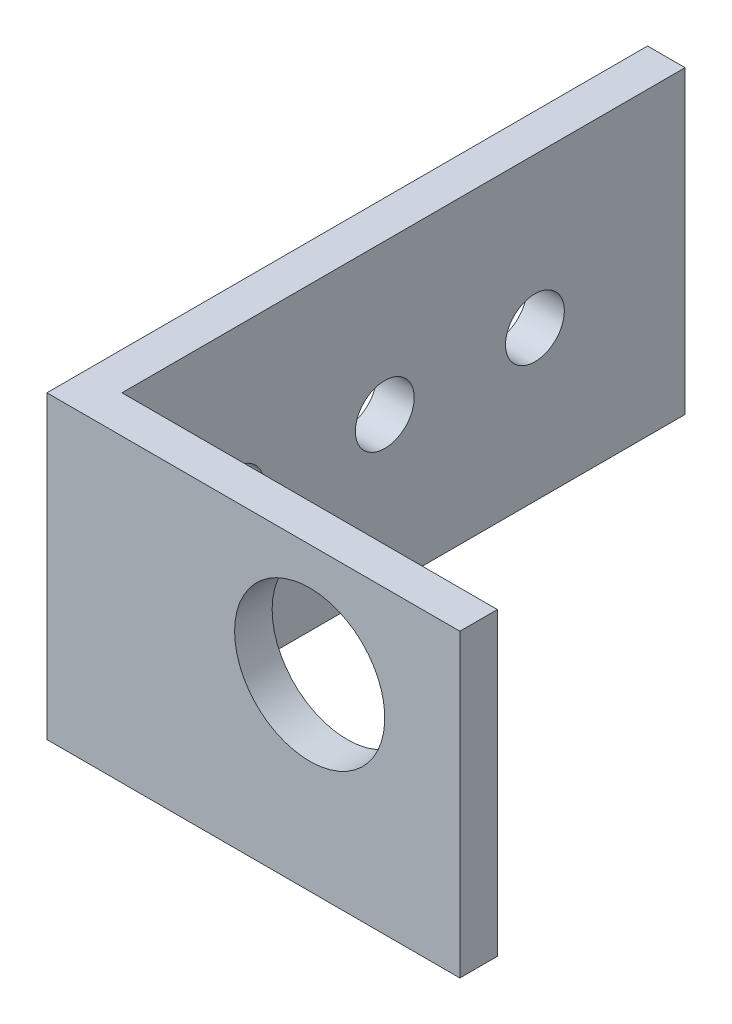
ISO-10303-21;
HEADER;
FILE_DESCRIPTION(('STEP AP214'),'2;1');
FILE_NAME('part.step','',(''),(''),'','','');
FILE_SCHEMA(('AUTOMOTIVE_DESIGN { 1 0 10303 214 1 1 1 1 }'));
ENDSEC;
DATA;
#1=APPLICATION_CONTEXT('core data for automotive mechanical design processes');
#2=APPLICATION_PROTOCOL_DEFINITION('international standard','automotive_design',2000,#1);
#3=PRODUCT_CONTEXT('',#1,'mechanical');
#4=PRODUCT('Part','Part','',(#3));
#5=PRODUCT_RELATED_PRODUCT_CATEGORY('part','',(#4));
#6=PRODUCT_DEFINITION_FORMATION('','',#4);
#7=PRODUCT_DEFINITION_CONTEXT('part definition',#1,'design');
#8=PRODUCT_DEFINITION('design','',#6,#7);
#9=PRODUCT_DEFINITION_SHAPE('','',#8);
#10=(LENGTH_UNIT() NAMED_UNIT(*) SI_UNIT(.MILLI.,.METRE.));
#11=(NAMED_UNIT(*) PLANE_ANGLE_UNIT() SI_UNIT($,.RADIAN.));
#12=(NAMED_UNIT(*) SI_UNIT($,.STERADIAN.) SOLID_ANGLE_UNIT());
#13=UNCERTAINTY_MEASURE_WITH_UNIT(LENGTH_MEASURE(1.E-05),#10,'distance_accuracy_value','');
#14=(GEOMETRIC_REPRESENTATION_CONTEXT(3) GLOBAL_UNCERTAINTY_ASSIGNED_CONTEXT((#13)) GLOBAL_UNIT_ASSIGNED_CONTEXT((#10,
#11,#12)) REPRESENTATION_CONTEXT('',''));
#15=CARTESIAN_POINT('',(0.,0.,0.));
#16=DIRECTION('',(0.,0.,1.));
#17=DIRECTION('',(1.,0.,0.));
#18=AXIS2_PLACEMENT_3D('',#15,#16,#17);
#19=CARTESIAN_POINT('',(34.925,25.4,0.));
#20=DIRECTION('',(0.,0.,-1.));
#21=DIRECTION('',(-1.,0.,0.));
#22=AXIS2_PLACEMENT_3D('',#19,#20,#21);
#23=PLANE('',#22);
#24=CARTESIAN_POINT('',(22.225,15.875,0.));
#25=DIRECTION('',(0.,0.,-1.));
#26=DIRECTION('',(-1.,0.,0.));
#27=AXIS2_PLACEMENT_3D('',#24,#25,#26);
#28=CIRCLE('',#27,6.35);
#29=CARTESIAN_POINT('',(15.875,15.875,0.));
#30=VERTEX_POINT('',#29);
#31=EDGE_CURVE('E133',#30,#30,#28,.T.);
#32=ORIENTED_EDGE('',*,*,#31,.T.);
#33=EDGE_LOOP('',(#32));
#34=FACE_BOUND('',#33,.T.);
#35=DIRECTION('',(1.,0.,0.));
#36=VECTOR('',#35,1.);
#37=CARTESIAN_POINT('',(34.925,0.,0.));
#38=LINE('',#37,#36);
#39=CARTESIAN_POINT('',(0.,0.,0.));
#40=VERTEX_POINT('',#39);
#41=CARTESIAN_POINT('',(34.925,0.,0.));
#42=VERTEX_POINT('',#41);
#43=EDGE_CURVE('E128',#40,#42,#38,.T.);
#44=ORIENTED_EDGE('',*,*,#43,.T.);
#45=DIRECTION('',(0.,-1.,0.));
#46=VECTOR('',#45,1.);
#47=CARTESIAN_POINT('',(34.925,25.4,0.));
#48=LINE('',#47,#46);
#49=CARTESIAN_POINT('',(34.925,25.4,0.));
#50=VERTEX_POINT('',#49);
#51=EDGE_CURVE('E11',#50,#42,#48,.T.);
#52=ORIENTED_EDGE('',*,*,#51,.F.);
#53=DIRECTION('',(1.,0.,0.));
#54=VECTOR('',#53,1.);
#55=CARTESIAN_POINT('',(34.925,25.4,0.));
#56=LINE('',#55,#54);
#57=CARTESIAN_POINT('',(0.,25.4,0.));
#58=VERTEX_POINT('',#57);
#59=EDGE_CURVE('E145',#58,#50,#56,.T.);
#60=ORIENTED_EDGE('',*,*,#59,.F.);
#61=DIRECTION('',(0.,-1.,0.));
#62=VECTOR('',#61,1.);
#63=CARTESIAN_POINT('',(0.,25.4,0.));
#64=LINE('',#63,#62);
#65=EDGE_CURVE('E124',#58,#40,#64,.T.);
#66=ORIENTED_EDGE('',*,*,#65,.T.);
#67=EDGE_LOOP('',(#44,#52,#60,#66));
#68=FACE_BOUND('',#67,.T.);
#69=ADVANCED_FACE('F39',(#34,#68),#23,.F.);
#70=CARTESIAN_POINT('',(34.925,25.4,-3.175));
#71=DIRECTION('',(-1.,0.,0.));
#72=DIRECTION('',(0.,0.,1.));
#73=AXIS2_PLACEMENT_3D('',#70,#71,#72);
#74=PLANE('',#73);
#75=DIRECTION('',(0.,0.,-1.));
#76=VECTOR('',#75,1.);
#77=CARTESIAN_POINT('',(34.925,0.,-3.175));
#78=LINE('',#77,#76);
#79=CARTESIAN_POINT('',(34.925,0.,-3.175));
#80=VERTEX_POINT('',#79);
#81=EDGE_CURVE('E132',#42,#80,#78,.T.);
#82=ORIENTED_EDGE('',*,*,#81,.T.);
#83=DIRECTION('',(0.,-1.,0.));
#84=VECTOR('',#83,1.);
#85=CARTESIAN_POINT('',(34.925,25.4,-3.175));
#86=LINE('',#85,#84);
#87=CARTESIAN_POINT('',(34.925,25.4,-3.175));
#88=VERTEX_POINT('',#87);
#89=EDGE_CURVE('E48',#88,#80,#86,.T.);
#90=ORIENTED_EDGE('',*,*,#89,.F.);
#91=DIRECTION('',(0.,0.,-1.));
#92=VECTOR('',#91,1.);
#93=CARTESIAN_POINT('',(34.925,25.4,-3.175));
#94=LINE('',#93,#92);
#95=EDGE_CURVE('E93',#50,#88,#94,.T.);
#96=ORIENTED_EDGE('',*,*,#95,.F.);
#97=ORIENTED_EDGE('',*,*,#51,.T.);
#98=EDGE_LOOP('',(#82,#90,#96,#97));
#99=FACE_BOUND('',#98,.T.);
#100=ADVANCED_FACE('F176',(#99),#74,.F.);
#101=CARTESIAN_POINT('',(3.175,25.4,-3.175));
#102=DIRECTION('',(0.,0.,1.));
#103=DIRECTION('',(1.,0.,0.));
#104=AXIS2_PLACEMENT_3D('',#101,#102,#103);
#105=PLANE('',#104);
#106=CARTESIAN_POINT('',(22.225,15.875,-3.175));
#107=DIRECTION('',(0.,0.,-1.));
#108=DIRECTION('',(-1.,0.,0.));
#109=AXIS2_PLACEMENT_3D('',#106,#107,#108);
#110=CIRCLE('',#109,6.35);
#111=CARTESIAN_POINT('',(15.875,15.875,-3.175));
#112=VERTEX_POINT('',#111);
#113=EDGE_CURVE('E185',#112,#112,#110,.T.);
#114=ORIENTED_EDGE('',*,*,#113,.F.);
#115=EDGE_LOOP('',(#114));
#116=FACE_BOUND('',#115,.T.);
#117=DIRECTION('',(-1.,0.,0.));
#118=VECTOR('',#117,1.);
#119=CARTESIAN_POINT('',(3.175,0.,-3.175));
#120=LINE('',#119,#118);
#121=CARTESIAN_POINT('',(3.175,0.,-3.175));
#122=VERTEX_POINT('',#121);
#123=EDGE_CURVE('E136',#80,#122,#120,.T.);
#124=ORIENTED_EDGE('',*,*,#123,.T.);
#125=DIRECTION('',(0.,-1.,0.));
#126=VECTOR('',#125,1.);
#127=CARTESIAN_POINT('',(3.175,25.4,-3.175));
#128=LINE('',#127,#126);
#129=CARTESIAN_POINT('',(3.175,25.4,-3.175));
#130=VERTEX_POINT('',#129);
#131=EDGE_CURVE('E117',#130,#122,#128,.T.);
#132=ORIENTED_EDGE('',*,*,#131,.F.);
#133=DIRECTION('',(-1.,0.,0.));
#134=VECTOR('',#133,1.);
#135=CARTESIAN_POINT('',(3.175,25.4,-3.175));
#136=LINE('',#135,#134);
#137=EDGE_CURVE('E106',#88,#130,#136,.T.);
#138=ORIENTED_EDGE('',*,*,#137,.F.);
#139=ORIENTED_EDGE('',*,*,#89,.T.);
#140=EDGE_LOOP('',(#124,#132,#138,#139));
#141=FACE_BOUND('',#140,.T.);
#142=ADVANCED_FACE('F155',(#116,#141),#105,.F.);
#143=CARTESIAN_POINT('',(3.175,25.4,-50.8));
#144=DIRECTION('',(-1.,0.,0.));
#145=DIRECTION('',(0.,0.,1.));
#146=AXIS2_PLACEMENT_3D('',#143,#144,#145);
#147=PLANE('',#146);
#148=CARTESIAN_POINT('',(3.175,12.7,-38.1));
#149=DIRECTION('',(1.,0.,0.));
#150=DIRECTION('',(0.,0.,-1.));
#151=AXIS2_PLACEMENT_3D('',#148,#149,#150);
#152=CIRCLE('',#151,2.4892);
#153=CARTESIAN_POINT('',(3.175,12.7,-40.5892));
#154=VERTEX_POINT('',#153);
#155=EDGE_CURVE('E205',#154,#154,#152,.T.);
#156=ORIENTED_EDGE('',*,*,#155,.F.);
#157=EDGE_LOOP('',(#156));
#158=FACE_BOUND('',#157,.T.);
#159=CARTESIAN_POINT('',(3.175,12.7,-12.7));
#160=DIRECTION('',(1.,0.,0.));
#161=DIRECTION('',(0.,0.,-1.));
#162=AXIS2_PLACEMENT_3D('',#159,#160,#161);
#163=CIRCLE('',#162,2.4892);
#164=CARTESIAN_POINT('',(3.175,12.7,-15.1892));
#165=VERTEX_POINT('',#164);
#166=EDGE_CURVE('E212',#165,#165,#163,.T.);
#167=ORIENTED_EDGE('',*,*,#166,.F.);
#168=EDGE_LOOP('',(#167));
#169=FACE_BOUND('',#168,.T.);
#170=CARTESIAN_POINT('',(3.175,12.7,-25.4));
#171=DIRECTION('',(1.,0.,0.));
#172=DIRECTION('',(0.,0.,-1.));
#173=AXIS2_PLACEMENT_3D('',#170,#171,#172);
#174=CIRCLE('',#173,2.4892);
#175=CARTESIAN_POINT('',(3.175,12.7,-27.8892));
#176=VERTEX_POINT('',#175);
#177=EDGE_CURVE('E192',#176,#176,#174,.T.);
#178=ORIENTED_EDGE('',*,*,#177,.F.);
#179=EDGE_LOOP('',(#178));
#180=FACE_BOUND('',#179,.T.);
#181=DIRECTION('',(0.,0.,-1.));
#182=VECTOR('',#181,1.);
#183=CARTESIAN_POINT('',(3.175,0.,-50.8));
#184=LINE('',#183,#182);
#185=CARTESIAN_POINT('',(3.175,0.,-50.8));
#186=VERTEX_POINT('',#185);
#187=EDGE_CURVE('E115',#122,#186,#184,.T.);
#188=ORIENTED_EDGE('',*,*,#187,.T.);
#189=DIRECTION('',(0.,-1.,0.));
#190=VECTOR('',#189,1.);
#191=CARTESIAN_POINT('',(3.175,25.4,-50.8));
#192=LINE('',#191,#190);
#193=CARTESIAN_POINT('',(3.175,25.4,-50.8));
#194=VERTEX_POINT('',#193);
#195=EDGE_CURVE('E112',#194,#186,#192,.T.);
#196=ORIENTED_EDGE('',*,*,#195,.F.);
#197=DIRECTION('',(0.,0.,-1.));
#198=VECTOR('',#197,1.);
#199=CARTESIAN_POINT('',(3.175,25.4,-50.8));
#200=LINE('',#199,#198);
#201=EDGE_CURVE('E100',#130,#194,#200,.T.);
#202=ORIENTED_EDGE('',*,*,#201,.F.);
#203=ORIENTED_EDGE('',*,*,#131,.T.);
#204=EDGE_LOOP('',(#188,#196,#202,#203));
#205=FACE_BOUND('',#204,.T.);
#206=ADVANCED_FACE('F113',(#158,#169,#180,#205),#147,.F.);
#207=CARTESIAN_POINT('',(0.,25.4,-50.8));
#208=DIRECTION('',(0.,0.,1.));
#209=DIRECTION('',(1.,0.,0.));
#210=AXIS2_PLACEMENT_3D('',#207,#208,#209);
#211=PLANE('',#210);
#212=DIRECTION('',(-1.,0.,0.));
#213=VECTOR('',#212,1.);
#214=CARTESIAN_POINT('',(0.,0.,-50.8));
#215=LINE('',#214,#213);
#216=CARTESIAN_POINT('',(0.,0.,-50.8));
#217=VERTEX_POINT('',#216);
#218=EDGE_CURVE('E79',#186,#217,#215,.T.);
#219=ORIENTED_EDGE('',*,*,#218,.T.);
#220=DIRECTION('',(0.,-1.,0.));
#221=VECTOR('',#220,1.);
#222=CARTESIAN_POINT('',(0.,25.4,-50.8));
#223=LINE('',#222,#221);
#224=CARTESIAN_POINT('',(0.,25.4,-50.8));
#225=VERTEX_POINT('',#224);
#226=EDGE_CURVE('E118',#225,#217,#223,.T.);
#227=ORIENTED_EDGE('',*,*,#226,.F.);
#228=DIRECTION('',(-1.,0.,0.));
#229=VECTOR('',#228,1.);
#230=CARTESIAN_POINT('',(0.,25.4,-50.8));
#231=LINE('',#230,#229);
#232=EDGE_CURVE('E104',#194,#225,#231,.T.);
#233=ORIENTED_EDGE('',*,*,#232,.F.);
#234=ORIENTED_EDGE('',*,*,#195,.T.);
#235=EDGE_LOOP('',(#219,#227,#233,#234));
#236=FACE_BOUND('',#235,.T.);
#237=ADVANCED_FACE('F120',(#236),#211,.F.);
#238=CARTESIAN_POINT('',(0.,25.4,0.));
#239=DIRECTION('',(1.,0.,0.));
#240=DIRECTION('',(0.,0.,-1.));
#241=AXIS2_PLACEMENT_3D('',#238,#239,#240);
#242=PLANE('',#241);
#243=CARTESIAN_POINT('',(0.,12.7,-38.1));
#244=DIRECTION('',(1.,0.,0.));
#245=DIRECTION('',(0.,0.,-1.));
#246=AXIS2_PLACEMENT_3D('',#243,#244,#245);
#247=CIRCLE('',#246,2.4892);
#248=CARTESIAN_POINT('',(0.,12.7,-40.5892));
#249=VERTEX_POINT('',#248);
#250=EDGE_CURVE('E209',#249,#249,#247,.T.);
#251=ORIENTED_EDGE('',*,*,#250,.T.);
#252=EDGE_LOOP('',(#251));
#253=FACE_BOUND('',#252,.T.);
#254=CARTESIAN_POINT('',(0.,12.7,-12.7));
#255=DIRECTION('',(1.,0.,0.));
#256=DIRECTION('',(0.,0.,-1.));
#257=AXIS2_PLACEMENT_3D('',#254,#255,#256);
#258=CIRCLE('',#257,2.4892);
#259=CARTESIAN_POINT('',(0.,12.7,-15.1892));
#260=VERTEX_POINT('',#259);
#261=EDGE_CURVE('E201',#260,#260,#258,.T.);
#262=ORIENTED_EDGE('',*,*,#261,.T.);
#263=EDGE_LOOP('',(#262));
#264=FACE_BOUND('',#263,.T.);
#265=CARTESIAN_POINT('',(0.,12.7,-25.4));
#266=DIRECTION('',(1.,0.,0.));
#267=DIRECTION('',(0.,0.,-1.));
#268=AXIS2_PLACEMENT_3D('',#265,#266,#267);
#269=CIRCLE('',#268,2.4892);
#270=CARTESIAN_POINT('',(0.,12.7,-27.8892));
#271=VERTEX_POINT('',#270);
#272=EDGE_CURVE('E189',#271,#271,#269,.T.);
#273=ORIENTED_EDGE('',*,*,#272,.T.);
#274=EDGE_LOOP('',(#273));
#275=FACE_BOUND('',#274,.T.);
#276=DIRECTION('',(0.,0.,1.));
#277=VECTOR('',#276,1.);
#278=CARTESIAN_POINT('',(0.,0.,0.));
#279=LINE('',#278,#277);
#280=EDGE_CURVE('E85',#217,#40,#279,.T.);
#281=ORIENTED_EDGE('',*,*,#280,.T.);
#282=ORIENTED_EDGE('',*,*,#65,.F.);
#283=DIRECTION('',(0.,0.,1.));
#284=VECTOR('',#283,1.);
#285=CARTESIAN_POINT('',(0.,25.4,0.));
#286=LINE('',#285,#284);
#287=EDGE_CURVE('E56',#225,#58,#286,.T.);
#288=ORIENTED_EDGE('',*,*,#287,.F.);
#289=ORIENTED_EDGE('',*,*,#226,.T.);
#290=EDGE_LOOP('',(#281,#282,#288,#289));
#291=FACE_BOUND('',#290,.T.);
#292=ADVANCED_FACE('F162',(#253,#264,#275,#291),#242,.F.);
#293=CARTESIAN_POINT('',(0.,25.4,0.));
#294=DIRECTION('',(0.,-1.,0.));
#295=DIRECTION('',(0.,0.,-1.));
#296=AXIS2_PLACEMENT_3D('',#293,#294,#295);
#297=PLANE('',#296);
#298=ORIENTED_EDGE('',*,*,#59,.T.);
#299=ORIENTED_EDGE('',*,*,#95,.T.);
#300=ORIENTED_EDGE('',*,*,#137,.T.);
#301=ORIENTED_EDGE('',*,*,#201,.T.);
#302=ORIENTED_EDGE('',*,*,#232,.T.);
#303=ORIENTED_EDGE('',*,*,#287,.T.);
#304=EDGE_LOOP('',(#298,#299,#300,#301,#302,#303));
#305=FACE_BOUND('',#304,.T.);
#306=ADVANCED_FACE('F102',(#305),#297,.F.);
#307=CARTESIAN_POINT('',(0.,0.,0.));
#308=DIRECTION('',(0.,-1.,0.));
#309=DIRECTION('',(0.,0.,-1.));
#310=AXIS2_PLACEMENT_3D('',#307,#308,#309);
#311=PLANE('',#310);
#312=ORIENTED_EDGE('',*,*,#43,.F.);
#313=ORIENTED_EDGE('',*,*,#280,.F.);
#314=ORIENTED_EDGE('',*,*,#218,.F.);
#315=ORIENTED_EDGE('',*,*,#187,.F.);
#316=ORIENTED_EDGE('',*,*,#123,.F.);
#317=ORIENTED_EDGE('',*,*,#81,.F.);
#318=EDGE_LOOP('',(#312,#313,#314,#315,#316,#317));
#319=FACE_BOUND('',#318,.T.);
#320=ADVANCED_FACE('F158',(#319),#311,.T.);
#321=CARTESIAN_POINT('',(22.225,15.875,0.));
#322=DIRECTION('',(0.,0.,-1.));
#323=DIRECTION('',(-1.,0.,0.));
#324=AXIS2_PLACEMENT_3D('',#321,#322,#323);
#325=CYLINDRICAL_SURFACE('',#324,6.35);
#326=ORIENTED_EDGE('',*,*,#31,.F.);
#327=EDGE_LOOP('',(#326));
#328=FACE_BOUND('',#327,.T.);
#329=ORIENTED_EDGE('',*,*,#113,.T.);
#330=EDGE_LOOP('',(#329));
#331=FACE_BOUND('',#330,.T.);
#332=ADVANCED_FACE('F236',(#328,#331),#325,.F.);
#333=CARTESIAN_POINT('',(0.,12.7,-25.4));
#334=DIRECTION('',(1.,0.,0.));
#335=DIRECTION('',(0.,0.,-1.));
#336=AXIS2_PLACEMENT_3D('',#333,#334,#335);
#337=CYLINDRICAL_SURFACE('',#336,2.4892);
#338=ORIENTED_EDGE('',*,*,#272,.F.);
#339=EDGE_LOOP('',(#338));
#340=FACE_BOUND('',#339,.T.);
#341=ORIENTED_EDGE('',*,*,#177,.T.);
#342=EDGE_LOOP('',(#341));
#343=FACE_BOUND('',#342,.T.);
#344=ADVANCED_FACE('F225',(#340,#343),#337,.F.);
#345=CARTESIAN_POINT('',(0.,12.7,-12.7));
#346=DIRECTION('',(1.,0.,0.));
#347=DIRECTION('',(0.,0.,-1.));
#348=AXIS2_PLACEMENT_3D('',#345,#346,#347);
#349=CYLINDRICAL_SURFACE('',#348,2.4892);
#350=ORIENTED_EDGE('',*,*,#261,.F.);
#351=EDGE_LOOP('',(#350));
#352=FACE_BOUND('',#351,.T.);
#353=ORIENTED_EDGE('',*,*,#166,.T.);
#354=EDGE_LOOP('',(#353));
#355=FACE_BOUND('',#354,.T.);
#356=ADVANCED_FACE('F221',(#352,#355),#349,.F.);
#357=CARTESIAN_POINT('',(0.,12.7,-38.1));
#358=DIRECTION('',(1.,0.,0.));
#359=DIRECTION('',(0.,0.,-1.));
#360=AXIS2_PLACEMENT_3D('',#357,#358,#359);
#361=CYLINDRICAL_SURFACE('',#360,2.4892);
#362=ORIENTED_EDGE('',*,*,#250,.F.);
#363=EDGE_LOOP('',(#362));
#364=FACE_BOUND('',#363,.T.);
#365=ORIENTED_EDGE('',*,*,#155,.T.);
#366=EDGE_LOOP('',(#365));
#367=FACE_BOUND('',#366,.T.);
#368=ADVANCED_FACE('F224',(#364,#367),#361,.F.);
#369=CLOSED_SHELL('',(#69,#100,#142,#206,#237,#292,#306,#320,#332,#344,#356,#368));
#370=MANIFOLD_SOLID_BREP('B2',#369);
#371=ADVANCED_BREP_SHAPE_REPRESENTATION('',(#18,#370),#14);
#372=SHAPE_DEFINITION_REPRESENTATION(#9,#371);
ENDSEC;
END-ISO-10303-21;
